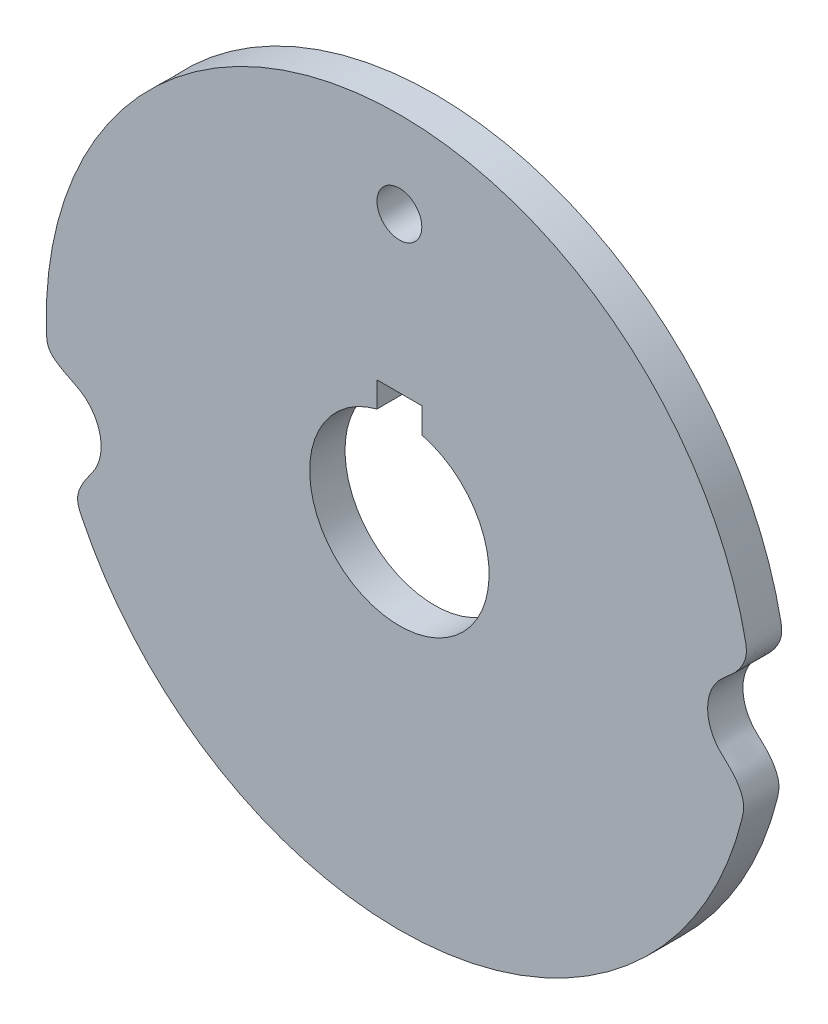
ISO-10303-21;
HEADER;
FILE_DESCRIPTION(('STEP AP214'),'2;1');
FILE_NAME('part.step','',(''),(''),'','','');
FILE_SCHEMA(('AUTOMOTIVE_DESIGN { 1 0 10303 214 1 1 1 1 }'));
ENDSEC;
DATA;
#1=APPLICATION_CONTEXT('core data for automotive mechanical design processes');
#2=APPLICATION_PROTOCOL_DEFINITION('international standard','automotive_design',2000,#1);
#3=PRODUCT_CONTEXT('',#1,'mechanical');
#4=PRODUCT('Part','Part','',(#3));
#5=PRODUCT_RELATED_PRODUCT_CATEGORY('part','',(#4));
#6=PRODUCT_DEFINITION_FORMATION('','',#4);
#7=PRODUCT_DEFINITION_CONTEXT('part definition',#1,'design');
#8=PRODUCT_DEFINITION('design','',#6,#7);
#9=PRODUCT_DEFINITION_SHAPE('','',#8);
#10=(LENGTH_UNIT() NAMED_UNIT(*) SI_UNIT(.MILLI.,.METRE.));
#11=(NAMED_UNIT(*) PLANE_ANGLE_UNIT() SI_UNIT($,.RADIAN.));
#12=(NAMED_UNIT(*) SI_UNIT($,.STERADIAN.) SOLID_ANGLE_UNIT());
#13=UNCERTAINTY_MEASURE_WITH_UNIT(LENGTH_MEASURE(1.E-05),#10,'distance_accuracy_value','');
#14=(GEOMETRIC_REPRESENTATION_CONTEXT(3) GLOBAL_UNCERTAINTY_ASSIGNED_CONTEXT((#13)) GLOBAL_UNIT_ASSIGNED_CONTEXT((#10,
#11,#12)) REPRESENTATION_CONTEXT('',''));
#15=CARTESIAN_POINT('',(0.,0.,0.));
#16=DIRECTION('',(0.,0.,1.));
#17=DIRECTION('',(1.,0.,0.));
#18=AXIS2_PLACEMENT_3D('',#15,#16,#17);
#19=CARTESIAN_POINT('',(45.4917506820387,20.7485088592758,5.));
#20=DIRECTION('',(0.,0.,-1.));
#21=DIRECTION('',(-1.,0.,0.));
#22=AXIS2_PLACEMENT_3D('',#19,#20,#21);
#23=PLANE('',#22);
#24=CARTESIAN_POINT('',(-44.9418348410485,-21.9141844730741,5.));
#25=CARTESIAN_POINT('',(-18.1526315854515,-76.8537579587144,5.));
#26=CARTESIAN_POINT('',(36.0317438804449,-60.9987173495729,5.));
#27=CARTESIAN_POINT('',(48.4463427665036,-12.3673712870055,5.));
#28=CARTESIAN_POINT('',(48.660545034586,-11.5282829908705,5.));
#29=CARTESIAN_POINT('',(49.045350665539,-9.83897648006247,5.));
#30=CARTESIAN_POINT('',(47.276754361056,-6.94052543342477,5.));
#31=CARTESIAN_POINT('',(45.8538238907968,-5.8914257689936,5.));
#32=CARTESIAN_POINT('',(45.2739309115651,-5.24824934451879,5.));
#33=CARTESIAN_POINT('',(42.9068285338988,-2.62282620928703,5.));
#34=CARTESIAN_POINT('',(42.9772547215746,0.911443228298761,5.));
#35=CARTESIAN_POINT('',(45.4470683279636,3.44048278019575,5.));
#36=CARTESIAN_POINT('',(46.0521235143674,4.06004714470375,5.));
#37=CARTESIAN_POINT('',(47.5157179329526,5.05162800726014,5.));
#38=CARTESIAN_POINT('',(49.3983773274958,7.87732172069134,5.));
#39=CARTESIAN_POINT('',(49.0811749192404,9.58061690745982,5.));
#40=CARTESIAN_POINT('',(48.9005698734503,10.4275723949546,5.));
#41=CARTESIAN_POINT('',(32.0504783925041,89.4468344656478,5.));
#42=CARTESIAN_POINT('',(-48.3804042244223,81.7759490815894,5.));
#43=CARTESIAN_POINT('',(-49.9900761601583,0.996135282766785,5.));
#44=CARTESIAN_POINT('',(-50.0073881853681,0.127348207660094,5.));
#45=CARTESIAN_POINT('',(-50.002184026165,-0.74832712180159,5.));
#46=CARTESIAN_POINT('',(-49.9734197490859,-1.63012839422946,5.));
#47=CARTESIAN_POINT('',(-49.9484418690121,-2.39585340692582,5.));
#48=CARTESIAN_POINT('',(-49.863287309302,-3.92615525068723,5.));
#49=CARTESIAN_POINT('',(-47.185136206711,-5.49285470020049,5.));
#50=CARTESIAN_POINT('',(-45.7504005815914,-6.09805348934358,5.));
#51=CARTESIAN_POINT('',(-45.1088096542993,-6.51676552831341,5.));
#52=CARTESIAN_POINT('',(-42.1484784237305,-8.44872290621634,5.));
#53=CARTESIAN_POINT('',(-41.3117848081689,-11.8832482152501,5.));
#54=CARTESIAN_POINT('',(-43.051862150856,-14.9602843128904,5.));
#55=CARTESIAN_POINT('',(-43.4459962480945,-15.6572446230804,5.));
#56=CARTESIAN_POINT('',(-44.4979078363293,-16.9020737536404,5.));
#57=CARTESIAN_POINT('',(-45.9600410562821,-19.738272259708,5.));
#58=CARTESIAN_POINT('',(-45.2927617135182,-21.1945000347507,5.));
#59=CARTESIAN_POINT('',(-44.9418348410485,-21.9141844730741,5.));
#60=(BOUNDED_CURVE() B_SPLINE_CURVE(3,(#24,#25,#26,#27,#28,#29,#30,#31,#32,#33,#34,#35,#36,#37,
#38,#39,#40,#41,#42,#43,#44,#45,#46,#47,#48,#49,#50,#51,#52,#53,#54,#55,#56,#57,#58,#59),
.UNSPECIFIED.,.T.,.F.) B_SPLINE_CURVE_WITH_KNOTS((4,3,1,1,3,3,1,1,3,3,3,1,1,3,3,1,1,4),(0.,
0.349446212226112,0.360869056136259,0.372291900046406,0.383714743956554,0.421924910565049,
0.433347754475196,0.444770598385343,0.456193442295491,0.892968420415867,0.904255528894142,
0.913910700131936,0.923565871369731,0.933221042607526,0.969728162456282,0.979818774970855,
0.989909387485427,1.),
.UNSPECIFIED.) CURVE() GEOMETRIC_REPRESENTATION_ITEM() RATIONAL_B_SPLINE_CURVE((0.716785542822112,
0.433429310315589,0.527834129374885,1.,1.,1.,1.,1.,1.,0.819474602239125,0.819474602239125,1.,1.,
1.,1.,1.,1.,0.40983696318325,0.40983696318325,1.,0.984749048022199,0.969892210080214,
0.955429486174045,0.955429486174045,0.955429486174045,0.955429486174045,0.955429486174045,
0.955429486174045,0.782950198156975,0.782950198156975,0.955429486174045,0.955429486174045,
0.955429486174045,0.955429486174045,0.955429486174045,0.955429486174045)) REPRESENTATION_ITEM(''));
#61=CARTESIAN_POINT('',(-44.9418348410485,-21.9141844730741,5.));
#62=VERTEX_POINT('',#61);
#63=EDGE_CURVE('E11',#62,#62,#60,.T.);
#64=ORIENTED_EDGE('',*,*,#63,.T.);
#65=EDGE_LOOP('',(#64));
#66=FACE_BOUND('',#65,.T.);
#67=DIRECTION('',(0.,-1.,0.));
#68=VECTOR('',#67,1.);
#69=CARTESIAN_POINT('',(-3.175,12.2967221242085,5.));
#70=LINE('',#69,#68);
#71=CARTESIAN_POINT('',(-3.175,15.875,5.));
#72=VERTEX_POINT('',#71);
#73=CARTESIAN_POINT('',(-3.175,12.2967221242085,5.));
#74=VERTEX_POINT('',#73);
#75=EDGE_CURVE('E76',#72,#74,#70,.T.);
#76=ORIENTED_EDGE('',*,*,#75,.F.);
#77=DIRECTION('',(-1.,0.,0.));
#78=VECTOR('',#77,1.);
#79=CARTESIAN_POINT('',(3.175,15.875,5.));
#80=LINE('',#79,#78);
#81=CARTESIAN_POINT('',(3.175,15.875,5.));
#82=VERTEX_POINT('',#81);
#83=EDGE_CURVE('E98',#82,#72,#80,.T.);
#84=ORIENTED_EDGE('',*,*,#83,.F.);
#85=DIRECTION('',(0.,1.,0.));
#86=VECTOR('',#85,1.);
#87=CARTESIAN_POINT('',(3.175,12.2967221242086,5.));
#88=LINE('',#87,#86);
#89=CARTESIAN_POINT('',(3.175,12.2967221242086,5.));
#90=VERTEX_POINT('',#89);
#91=EDGE_CURVE('E96',#90,#82,#88,.T.);
#92=ORIENTED_EDGE('',*,*,#91,.F.);
#93=CARTESIAN_POINT('',(0.,0.,5.));
#94=DIRECTION('',(0.,0.,1.));
#95=DIRECTION('',(1.,0.,0.));
#96=AXIS2_PLACEMENT_3D('',#93,#94,#95);
#97=CIRCLE('',#96,12.7);
#98=EDGE_CURVE('E84',#74,#90,#97,.T.);
#99=ORIENTED_EDGE('',*,*,#98,.F.);
#100=EDGE_LOOP('',(#76,#84,#92,#99));
#101=FACE_BOUND('',#100,.T.);
#102=CARTESIAN_POINT('',(0.,37.79,5.));
#103=DIRECTION('',(0.,0.,1.));
#104=DIRECTION('',(1.,0.,0.));
#105=AXIS2_PLACEMENT_3D('',#102,#103,#104);
#106=CIRCLE('',#105,3.175);
#107=CARTESIAN_POINT('',(3.175,37.79,5.));
#108=VERTEX_POINT('',#107);
#109=EDGE_CURVE('E104',#108,#108,#106,.T.);
#110=ORIENTED_EDGE('',*,*,#109,.F.);
#111=EDGE_LOOP('',(#110));
#112=FACE_BOUND('',#111,.T.);
#113=ADVANCED_FACE('F33',(#66,#101,#112),#23,.F.);
#114=CARTESIAN_POINT('',(45.4917506820387,20.7485088592758,0.));
#115=DIRECTION('',(0.,0.,-1.));
#116=DIRECTION('',(-1.,0.,0.));
#117=AXIS2_PLACEMENT_3D('',#114,#115,#116);
#118=PLANE('',#117);
#119=DIRECTION('',(-1.,0.,0.));
#120=VECTOR('',#119,1.);
#121=CARTESIAN_POINT('',(3.175,15.875,0.));
#122=LINE('',#121,#120);
#123=CARTESIAN_POINT('',(3.175,15.875,0.));
#124=VERTEX_POINT('',#123);
#125=CARTESIAN_POINT('',(-3.175,15.875,0.));
#126=VERTEX_POINT('',#125);
#127=EDGE_CURVE('E85',#124,#126,#122,.T.);
#128=ORIENTED_EDGE('',*,*,#127,.T.);
#129=DIRECTION('',(0.,-1.,0.));
#130=VECTOR('',#129,1.);
#131=CARTESIAN_POINT('',(-3.175,12.2967221242085,0.));
#132=LINE('',#131,#130);
#133=CARTESIAN_POINT('',(-3.175,12.2967221242085,0.));
#134=VERTEX_POINT('',#133);
#135=EDGE_CURVE('E58',#126,#134,#132,.T.);
#136=ORIENTED_EDGE('',*,*,#135,.T.);
#137=CARTESIAN_POINT('',(0.,0.,0.));
#138=DIRECTION('',(0.,0.,1.));
#139=DIRECTION('',(1.,0.,0.));
#140=AXIS2_PLACEMENT_3D('',#137,#138,#139);
#141=CIRCLE('',#140,12.7);
#142=CARTESIAN_POINT('',(3.175,12.2967221242086,0.));
#143=VERTEX_POINT('',#142);
#144=EDGE_CURVE('E91',#134,#143,#141,.T.);
#145=ORIENTED_EDGE('',*,*,#144,.T.);
#146=DIRECTION('',(0.,1.,0.));
#147=VECTOR('',#146,1.);
#148=CARTESIAN_POINT('',(3.175,12.2967221242086,0.));
#149=LINE('',#148,#147);
#150=EDGE_CURVE('E106',#143,#124,#149,.T.);
#151=ORIENTED_EDGE('',*,*,#150,.T.);
#152=EDGE_LOOP('',(#128,#136,#145,#151));
#153=FACE_BOUND('',#152,.T.);
#154=CARTESIAN_POINT('',(-44.9418348410485,-21.9141844730741,0.));
#155=CARTESIAN_POINT('',(-18.1526315854515,-76.8537579587144,0.));
#156=CARTESIAN_POINT('',(36.0317438804449,-60.9987173495729,0.));
#157=CARTESIAN_POINT('',(48.4463427665036,-12.3673712870055,0.));
#158=CARTESIAN_POINT('',(48.660545034586,-11.5282829908705,0.));
#159=CARTESIAN_POINT('',(49.045350665539,-9.83897648006247,0.));
#160=CARTESIAN_POINT('',(47.276754361056,-6.94052543342477,0.));
#161=CARTESIAN_POINT('',(45.8538238907968,-5.8914257689936,0.));
#162=CARTESIAN_POINT('',(45.2739309115651,-5.24824934451879,0.));
#163=CARTESIAN_POINT('',(42.9068285338988,-2.62282620928703,0.));
#164=CARTESIAN_POINT('',(42.9772547215746,0.911443228298761,0.));
#165=CARTESIAN_POINT('',(45.4470683279636,3.44048278019575,0.));
#166=CARTESIAN_POINT('',(46.0521235143674,4.06004714470375,0.));
#167=CARTESIAN_POINT('',(47.5157179329526,5.05162800726014,0.));
#168=CARTESIAN_POINT('',(49.3983773274958,7.87732172069134,0.));
#169=CARTESIAN_POINT('',(49.0811749192404,9.58061690745982,0.));
#170=CARTESIAN_POINT('',(48.9005698734503,10.4275723949546,0.));
#171=CARTESIAN_POINT('',(32.0504783925041,89.4468344656478,0.));
#172=CARTESIAN_POINT('',(-48.3804042244223,81.7759490815894,0.));
#173=CARTESIAN_POINT('',(-49.9900761601583,0.996135282766785,0.));
#174=CARTESIAN_POINT('',(-50.0073881853681,0.127348207660094,0.));
#175=CARTESIAN_POINT('',(-50.002184026165,-0.74832712180159,0.));
#176=CARTESIAN_POINT('',(-49.9734197490859,-1.63012839422946,0.));
#177=CARTESIAN_POINT('',(-49.9484418690121,-2.39585340692582,0.));
#178=CARTESIAN_POINT('',(-49.863287309302,-3.92615525068723,0.));
#179=CARTESIAN_POINT('',(-47.185136206711,-5.49285470020049,0.));
#180=CARTESIAN_POINT('',(-45.7504005815914,-6.09805348934358,0.));
#181=CARTESIAN_POINT('',(-45.1088096542993,-6.51676552831341,0.));
#182=CARTESIAN_POINT('',(-42.1484784237305,-8.44872290621634,0.));
#183=CARTESIAN_POINT('',(-41.3117848081689,-11.8832482152501,0.));
#184=CARTESIAN_POINT('',(-43.051862150856,-14.9602843128904,0.));
#185=CARTESIAN_POINT('',(-43.4459962480945,-15.6572446230804,0.));
#186=CARTESIAN_POINT('',(-44.4979078363293,-16.9020737536404,0.));
#187=CARTESIAN_POINT('',(-45.9600410562821,-19.738272259708,0.));
#188=CARTESIAN_POINT('',(-45.2927617135182,-21.1945000347507,0.));
#189=CARTESIAN_POINT('',(-44.9418348410485,-21.9141844730741,0.));
#190=(BOUNDED_CURVE() B_SPLINE_CURVE(3,(#154,#155,#156,#157,#158,#159,#160,#161,#162,#163,#164,
#165,#166,#167,#168,#169,#170,#171,#172,#173,#174,#175,#176,#177,#178,#179,#180,#181,#182,#183,
#184,#185,#186,#187,#188,#189),.UNSPECIFIED.,.T.,.F.) B_SPLINE_CURVE_WITH_KNOTS((4,3,1,1,3,3,1,
1,3,3,3,1,1,3,3,1,1,4),(0.,0.349446212226112,0.360869056136259,0.372291900046406,
0.383714743956554,0.421924910565049,0.433347754475196,0.444770598385343,0.456193442295491,
0.892968420415867,0.904255528894142,0.913910700131936,0.923565871369731,0.933221042607526,
0.969728162456282,0.979818774970855,0.989909387485427,1.),
.UNSPECIFIED.) CURVE() GEOMETRIC_REPRESENTATION_ITEM() RATIONAL_B_SPLINE_CURVE((0.716785542822112,
0.433429310315589,0.527834129374885,1.,1.,1.,1.,1.,1.,0.819474602239125,0.819474602239125,1.,1.,
1.,1.,1.,1.,0.40983696318325,0.40983696318325,1.,0.984749048022199,0.969892210080214,
0.955429486174045,0.955429486174045,0.955429486174045,0.955429486174045,0.955429486174045,
0.955429486174045,0.782950198156975,0.782950198156975,0.955429486174045,0.955429486174045,
0.955429486174045,0.955429486174045,0.955429486174045,0.955429486174045)) REPRESENTATION_ITEM(''));
#191=CARTESIAN_POINT('',(-44.9418348410485,-21.9141844730741,0.));
#192=VERTEX_POINT('',#191);
#193=EDGE_CURVE('E38',#192,#192,#190,.T.);
#194=ORIENTED_EDGE('',*,*,#193,.F.);
#195=EDGE_LOOP('',(#194));
#196=FACE_BOUND('',#195,.T.);
#197=CARTESIAN_POINT('',(0.,37.79,0.));
#198=DIRECTION('',(0.,0.,1.));
#199=DIRECTION('',(1.,0.,0.));
#200=AXIS2_PLACEMENT_3D('',#197,#198,#199);
#201=CIRCLE('',#200,3.175);
#202=CARTESIAN_POINT('',(3.175,37.79,0.));
#203=VERTEX_POINT('',#202);
#204=EDGE_CURVE('E199',#203,#203,#201,.T.);
#205=ORIENTED_EDGE('',*,*,#204,.T.);
#206=EDGE_LOOP('',(#205));
#207=FACE_BOUND('',#206,.T.);
#208=ADVANCED_FACE('F123',(#153,#196,#207),#118,.T.);
#209=DIRECTION('',(0.,0.,-1.));
#210=VECTOR('',#209,1.);
#211=SURFACE_OF_LINEAR_EXTRUSION('',#60,#210);
#212=ORIENTED_EDGE('',*,*,#63,.F.);
#213=EDGE_LOOP('',(#212));
#214=FACE_BOUND('',#213,.T.);
#215=ORIENTED_EDGE('',*,*,#193,.T.);
#216=EDGE_LOOP('',(#215));
#217=FACE_BOUND('',#216,.T.);
#218=ADVANCED_FACE('F35',(#214,#217),#211,.F.);
#219=CARTESIAN_POINT('',(-3.175,12.2967221242085,5.));
#220=DIRECTION('',(1.,0.,0.));
#221=DIRECTION('',(0.,0.,-1.));
#222=AXIS2_PLACEMENT_3D('',#219,#220,#221);
#223=PLANE('',#222);
#224=ORIENTED_EDGE('',*,*,#135,.F.);
#225=DIRECTION('',(0.,0.,-1.));
#226=VECTOR('',#225,1.);
#227=CARTESIAN_POINT('',(-3.175,15.875,5.));
#228=LINE('',#227,#226);
#229=EDGE_CURVE('E80',#72,#126,#228,.T.);
#230=ORIENTED_EDGE('',*,*,#229,.F.);
#231=ORIENTED_EDGE('',*,*,#75,.T.);
#232=DIRECTION('',(0.,0.,-1.));
#233=VECTOR('',#232,1.);
#234=CARTESIAN_POINT('',(-3.175,12.2967221242085,5.));
#235=LINE('',#234,#233);
#236=EDGE_CURVE('E79',#74,#134,#235,.T.);
#237=ORIENTED_EDGE('',*,*,#236,.T.);
#238=EDGE_LOOP('',(#224,#230,#231,#237));
#239=FACE_BOUND('',#238,.T.);
#240=ADVANCED_FACE('F78',(#239),#223,.T.);
#241=CARTESIAN_POINT('',(0.,0.,5.));
#242=DIRECTION('',(0.,0.,-1.));
#243=DIRECTION('',(-1.,0.,0.));
#244=AXIS2_PLACEMENT_3D('',#241,#242,#243);
#245=CYLINDRICAL_SURFACE('',#244,12.7);
#246=ORIENTED_EDGE('',*,*,#144,.F.);
#247=ORIENTED_EDGE('',*,*,#236,.F.);
#248=ORIENTED_EDGE('',*,*,#98,.T.);
#249=DIRECTION('',(0.,0.,-1.));
#250=VECTOR('',#249,1.);
#251=CARTESIAN_POINT('',(3.175,12.2967221242086,5.));
#252=LINE('',#251,#250);
#253=EDGE_CURVE('E92',#90,#143,#252,.T.);
#254=ORIENTED_EDGE('',*,*,#253,.T.);
#255=EDGE_LOOP('',(#246,#247,#248,#254));
#256=FACE_BOUND('',#255,.T.);
#257=ADVANCED_FACE('F88',(#256),#245,.F.);
#258=CARTESIAN_POINT('',(3.175,12.2967221242086,5.));
#259=DIRECTION('',(-1.,0.,0.));
#260=DIRECTION('',(0.,0.,1.));
#261=AXIS2_PLACEMENT_3D('',#258,#259,#260);
#262=PLANE('',#261);
#263=ORIENTED_EDGE('',*,*,#150,.F.);
#264=ORIENTED_EDGE('',*,*,#253,.F.);
#265=ORIENTED_EDGE('',*,*,#91,.T.);
#266=DIRECTION('',(0.,0.,-1.));
#267=VECTOR('',#266,1.);
#268=CARTESIAN_POINT('',(3.175,15.875,5.));
#269=LINE('',#268,#267);
#270=EDGE_CURVE('E50',#82,#124,#269,.T.);
#271=ORIENTED_EDGE('',*,*,#270,.T.);
#272=EDGE_LOOP('',(#263,#264,#265,#271));
#273=FACE_BOUND('',#272,.T.);
#274=ADVANCED_FACE('F121',(#273),#262,.T.);
#275=CARTESIAN_POINT('',(3.175,15.875,5.));
#276=DIRECTION('',(0.,-1.,0.));
#277=DIRECTION('',(0.,0.,-1.));
#278=AXIS2_PLACEMENT_3D('',#275,#276,#277);
#279=PLANE('',#278);
#280=ORIENTED_EDGE('',*,*,#127,.F.);
#281=ORIENTED_EDGE('',*,*,#270,.F.);
#282=ORIENTED_EDGE('',*,*,#83,.T.);
#283=ORIENTED_EDGE('',*,*,#229,.T.);
#284=EDGE_LOOP('',(#280,#281,#282,#283));
#285=FACE_BOUND('',#284,.T.);
#286=ADVANCED_FACE('F125',(#285),#279,.T.);
#287=CARTESIAN_POINT('',(0.,37.79,5.));
#288=DIRECTION('',(0.,0.,-1.));
#289=DIRECTION('',(-1.,0.,0.));
#290=AXIS2_PLACEMENT_3D('',#287,#288,#289);
#291=CYLINDRICAL_SURFACE('',#290,3.175);
#292=ORIENTED_EDGE('',*,*,#109,.T.);
#293=EDGE_LOOP('',(#292));
#294=FACE_BOUND('',#293,.T.);
#295=ORIENTED_EDGE('',*,*,#204,.F.);
#296=EDGE_LOOP('',(#295));
#297=FACE_BOUND('',#296,.T.);
#298=ADVANCED_FACE('F127',(#294,#297),#291,.F.);
#299=CLOSED_SHELL('',(#113,#208,#218,#240,#257,#274,#286,#298));
#300=MANIFOLD_SOLID_BREP('B2',#299);
#301=ADVANCED_BREP_SHAPE_REPRESENTATION('',(#18,#300),#14);
#302=SHAPE_DEFINITION_REPRESENTATION(#9,#301);
ENDSEC;
END-ISO-10303-21;
